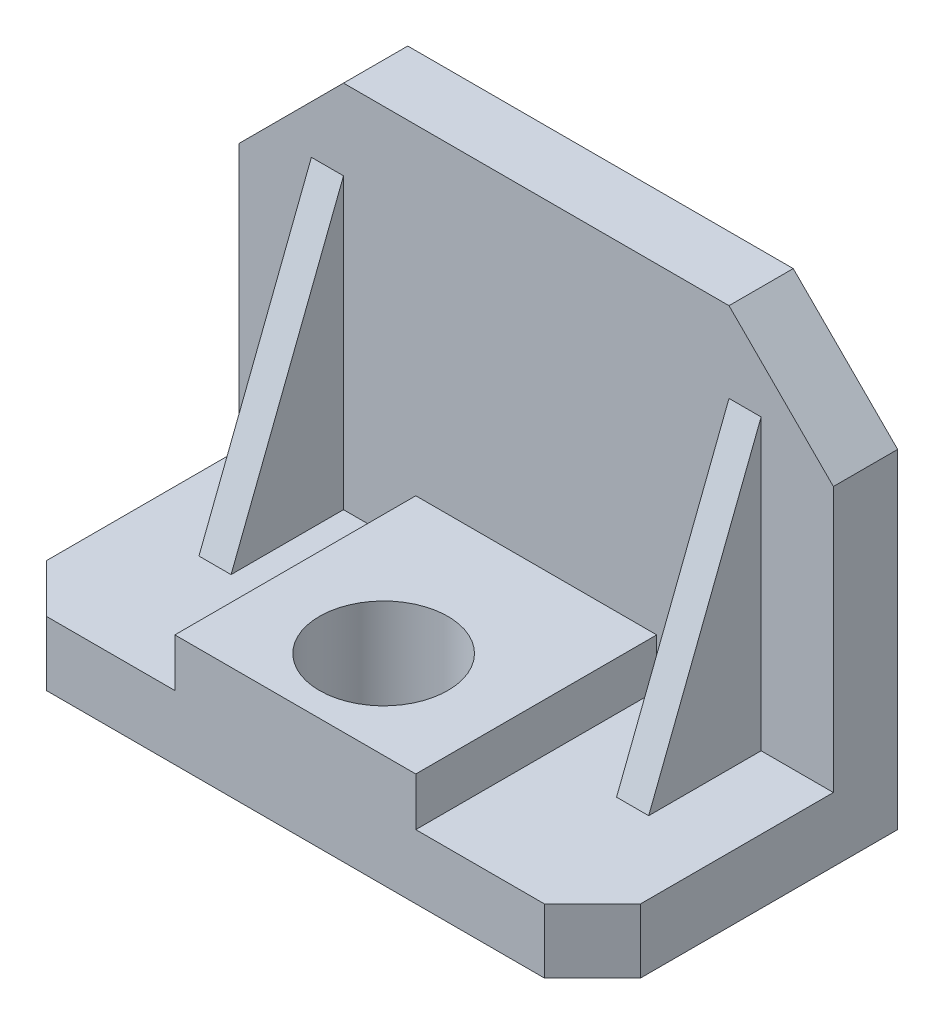
ISO-10303-21;
HEADER;
FILE_DESCRIPTION(('STEP AP214'),'2;1');
FILE_NAME('part.step','',(''),(''),'','','');
FILE_SCHEMA(('AUTOMOTIVE_DESIGN { 1 0 10303 214 1 1 1 1 }'));
ENDSEC;
DATA;
#1=APPLICATION_CONTEXT('core data for automotive mechanical design processes');
#2=APPLICATION_PROTOCOL_DEFINITION('international standard','automotive_design',2000,#1);
#3=PRODUCT_CONTEXT('',#1,'mechanical');
#4=PRODUCT('Part','Part','',(#3));
#5=PRODUCT_RELATED_PRODUCT_CATEGORY('part','',(#4));
#6=PRODUCT_DEFINITION_FORMATION('','',#4);
#7=PRODUCT_DEFINITION_CONTEXT('part definition',#1,'design');
#8=PRODUCT_DEFINITION('design','',#6,#7);
#9=PRODUCT_DEFINITION_SHAPE('','',#8);
#10=(LENGTH_UNIT() NAMED_UNIT(*) SI_UNIT(.MILLI.,.METRE.));
#11=(NAMED_UNIT(*) PLANE_ANGLE_UNIT() SI_UNIT($,.RADIAN.));
#12=(NAMED_UNIT(*) SI_UNIT($,.STERADIAN.) SOLID_ANGLE_UNIT());
#13=UNCERTAINTY_MEASURE_WITH_UNIT(LENGTH_MEASURE(1.E-05),#10,'distance_accuracy_value','');
#14=(GEOMETRIC_REPRESENTATION_CONTEXT(3) GLOBAL_UNCERTAINTY_ASSIGNED_CONTEXT((#13)) GLOBAL_UNIT_ASSIGNED_CONTEXT((#10,
#11,#12)) REPRESENTATION_CONTEXT('',''));
#15=CARTESIAN_POINT('',(0.,0.,0.));
#16=DIRECTION('',(0.,0.,1.));
#17=DIRECTION('',(1.,0.,0.));
#18=AXIS2_PLACEMENT_3D('',#15,#16,#17);
#19=CARTESIAN_POINT('',(0.,0.,4.));
#20=DIRECTION('',(0.,0.,-1.));
#21=DIRECTION('',(-1.,0.,0.));
#22=AXIS2_PLACEMENT_3D('',#19,#20,#21);
#23=PLANE('',#22);
#24=DIRECTION('',(0.,-1.,0.));
#25=VECTOR('',#24,1.);
#26=CARTESIAN_POINT('',(-52.,14.,4.));
#27=LINE('',#26,#25);
#28=CARTESIAN_POINT('',(-52.,14.,4.));
#29=VERTEX_POINT('',#28);
#30=CARTESIAN_POINT('',(-52.,8.,4.));
#31=VERTEX_POINT('',#30);
#32=EDGE_CURVE('E288',#29,#31,#27,.T.);
#33=ORIENTED_EDGE('',*,*,#32,.F.);
#34=DIRECTION('',(-1.,0.,0.));
#35=VECTOR('',#34,1.);
#36=CARTESIAN_POINT('',(-52.,14.,4.));
#37=LINE('',#36,#35);
#38=CARTESIAN_POINT('',(-22.,14.,4.));
#39=VERTEX_POINT('',#38);
#40=EDGE_CURVE('E291',#39,#29,#37,.T.);
#41=ORIENTED_EDGE('',*,*,#40,.F.);
#42=DIRECTION('',(0.,-1.,0.));
#43=VECTOR('',#42,1.);
#44=CARTESIAN_POINT('',(-22.,14.,4.));
#45=LINE('',#44,#43);
#46=CARTESIAN_POINT('',(-22.,8.,4.));
#47=VERTEX_POINT('',#46);
#48=EDGE_CURVE('E290',#39,#47,#45,.T.);
#49=ORIENTED_EDGE('',*,*,#48,.T.);
#50=DIRECTION('',(-1.,0.,0.));
#51=VECTOR('',#50,1.);
#52=CARTESIAN_POINT('',(-74.,8.,4.));
#53=LINE('',#52,#51);
#54=CARTESIAN_POINT('',(-13.,8.,4.));
#55=VERTEX_POINT('',#54);
#56=EDGE_CURVE('E214',#55,#47,#53,.T.);
#57=ORIENTED_EDGE('',*,*,#56,.F.);
#58=DIRECTION('',(0.,-1.,0.));
#59=VECTOR('',#58,1.);
#60=CARTESIAN_POINT('',(-13.,0.,4.));
#61=LINE('',#60,#59);
#62=CARTESIAN_POINT('',(-13.,44.,4.));
#63=VERTEX_POINT('',#62);
#64=EDGE_CURVE('E182',#63,#55,#61,.T.);
#65=ORIENTED_EDGE('',*,*,#64,.F.);
#66=DIRECTION('',(-1.,0.,0.));
#67=VECTOR('',#66,1.);
#68=CARTESIAN_POINT('',(0.,44.,4.));
#69=LINE('',#68,#67);
#70=CARTESIAN_POINT('',(-9.,44.,4.));
#71=VERTEX_POINT('',#70);
#72=EDGE_CURVE('E261',#71,#63,#69,.T.);
#73=ORIENTED_EDGE('',*,*,#72,.F.);
#74=DIRECTION('',(0.,1.,0.));
#75=VECTOR('',#74,1.);
#76=CARTESIAN_POINT('',(-8.99999999999999,0.,4.));
#77=LINE('',#76,#75);
#78=CARTESIAN_POINT('',(-9.,8.,4.));
#79=VERTEX_POINT('',#78);
#80=EDGE_CURVE('E316',#79,#71,#77,.T.);
#81=ORIENTED_EDGE('',*,*,#80,.F.);
#82=CARTESIAN_POINT('',(0.,8.,4.));
#83=VERTEX_POINT('',#82);
#84=EDGE_CURVE('E207',#83,#79,#53,.T.);
#85=ORIENTED_EDGE('',*,*,#84,.F.);
#86=DIRECTION('',(0.,1.,0.));
#87=VECTOR('',#86,1.);
#88=CARTESIAN_POINT('',(0.,41.,4.));
#89=LINE('',#88,#87);
#90=CARTESIAN_POINT('',(0.,41.,4.));
#91=VERTEX_POINT('',#90);
#92=EDGE_CURVE('E219',#83,#91,#89,.T.);
#93=ORIENTED_EDGE('',*,*,#92,.T.);
#94=DIRECTION('',(-0.707106781186548,0.707106781186547,0.));
#95=VECTOR('',#94,1.);
#96=CARTESIAN_POINT('',(-13.,54.,4.));
#97=LINE('',#96,#95);
#98=CARTESIAN_POINT('',(-13.,54.,4.));
#99=VERTEX_POINT('',#98);
#100=EDGE_CURVE('E221',#91,#99,#97,.T.);
#101=ORIENTED_EDGE('',*,*,#100,.T.);
#102=DIRECTION('',(-1.,0.,0.));
#103=VECTOR('',#102,1.);
#104=CARTESIAN_POINT('',(-61.,54.,4.));
#105=LINE('',#104,#103);
#106=CARTESIAN_POINT('',(-61.,54.,4.));
#107=VERTEX_POINT('',#106);
#108=EDGE_CURVE('E224',#99,#107,#105,.T.);
#109=ORIENTED_EDGE('',*,*,#108,.T.);
#110=DIRECTION('',(-0.707106781186548,-0.707106781186547,0.));
#111=VECTOR('',#110,1.);
#112=CARTESIAN_POINT('',(-74.,41.,4.));
#113=LINE('',#112,#111);
#114=CARTESIAN_POINT('',(-74.,41.,4.));
#115=VERTEX_POINT('',#114);
#116=EDGE_CURVE('E226',#107,#115,#113,.T.);
#117=ORIENTED_EDGE('',*,*,#116,.T.);
#118=DIRECTION('',(0.,-1.,0.));
#119=VECTOR('',#118,1.);
#120=CARTESIAN_POINT('',(-74.,0.,4.));
#121=LINE('',#120,#119);
#122=CARTESIAN_POINT('',(-74.,8.,4.));
#123=VERTEX_POINT('',#122);
#124=EDGE_CURVE('E228',#115,#123,#121,.T.);
#125=ORIENTED_EDGE('',*,*,#124,.T.);
#126=CARTESIAN_POINT('',(-65.,8.,4.));
#127=VERTEX_POINT('',#126);
#128=EDGE_CURVE('E202',#127,#123,#53,.T.);
#129=ORIENTED_EDGE('',*,*,#128,.F.);
#130=DIRECTION('',(0.,-1.,0.));
#131=VECTOR('',#130,1.);
#132=CARTESIAN_POINT('',(-65.,0.,4.));
#133=LINE('',#132,#131);
#134=CARTESIAN_POINT('',(-65.,44.,4.));
#135=VERTEX_POINT('',#134);
#136=EDGE_CURVE('E200',#135,#127,#133,.T.);
#137=ORIENTED_EDGE('',*,*,#136,.F.);
#138=DIRECTION('',(-1.,0.,0.));
#139=VECTOR('',#138,1.);
#140=CARTESIAN_POINT('',(0.,44.,4.));
#141=LINE('',#140,#139);
#142=CARTESIAN_POINT('',(-61.,44.,4.));
#143=VERTEX_POINT('',#142);
#144=EDGE_CURVE('E259',#143,#135,#141,.T.);
#145=ORIENTED_EDGE('',*,*,#144,.F.);
#146=DIRECTION('',(0.,1.,0.));
#147=VECTOR('',#146,1.);
#148=CARTESIAN_POINT('',(-61.,0.,4.));
#149=LINE('',#148,#147);
#150=CARTESIAN_POINT('',(-61.,8.,4.));
#151=VERTEX_POINT('',#150);
#152=EDGE_CURVE('E188',#151,#143,#149,.T.);
#153=ORIENTED_EDGE('',*,*,#152,.F.);
#154=EDGE_CURVE('E193',#31,#151,#53,.T.);
#155=ORIENTED_EDGE('',*,*,#154,.F.);
#156=EDGE_LOOP('',(#33,#41,#49,#57,#65,#73,#81,#85,#93,#101,#109,#117,#125,#129,#137,#145,#153,#155));
#157=FACE_BOUND('',#156,.T.);
#158=ADVANCED_FACE('F33',(#157),#23,.F.);
#159=CARTESIAN_POINT('',(-74.,8.,34.));
#160=DIRECTION('',(0.,-1.,0.));
#161=DIRECTION('',(0.,0.,-1.));
#162=AXIS2_PLACEMENT_3D('',#159,#160,#161);
#163=PLANE('',#162);
#164=DIRECTION('',(1.,0.,0.));
#165=VECTOR('',#164,1.);
#166=CARTESIAN_POINT('',(-65.,8.,18.));
#167=LINE('',#166,#165);
#168=CARTESIAN_POINT('',(-65.,8.,18.));
#169=VERTEX_POINT('',#168);
#170=CARTESIAN_POINT('',(-61.,8.,18.));
#171=VERTEX_POINT('',#170);
#172=EDGE_CURVE('E170',#169,#171,#167,.T.);
#173=ORIENTED_EDGE('',*,*,#172,.F.);
#174=DIRECTION('',(0.,0.,-1.));
#175=VECTOR('',#174,1.);
#176=CARTESIAN_POINT('',(-65.,8.,18.));
#177=LINE('',#176,#175);
#178=EDGE_CURVE('E194',#169,#127,#177,.T.);
#179=ORIENTED_EDGE('',*,*,#178,.T.);
#180=ORIENTED_EDGE('',*,*,#128,.T.);
#181=DIRECTION('',(0.,0.,-1.));
#182=VECTOR('',#181,1.);
#183=CARTESIAN_POINT('',(-74.,8.,34.));
#184=LINE('',#183,#182);
#185=CARTESIAN_POINT('',(-74.,8.,28.));
#186=VERTEX_POINT('',#185);
#187=EDGE_CURVE('E211',#186,#123,#184,.T.);
#188=ORIENTED_EDGE('',*,*,#187,.F.);
#189=DIRECTION('',(-0.707315738687803,0.,-0.706897761917894));
#190=VECTOR('',#189,1.);
#191=CARTESIAN_POINT('',(-74.,8.,28.));
#192=LINE('',#191,#190);
#193=CARTESIAN_POINT('',(-67.9964523008071,8.,34.));
#194=VERTEX_POINT('',#193);
#195=EDGE_CURVE('E297',#194,#186,#192,.T.);
#196=ORIENTED_EDGE('',*,*,#195,.F.);
#197=DIRECTION('',(-1.,0.,0.));
#198=VECTOR('',#197,1.);
#199=CARTESIAN_POINT('',(-74.,8.,34.));
#200=LINE('',#199,#198);
#201=CARTESIAN_POINT('',(-52.,8.,34.));
#202=VERTEX_POINT('',#201);
#203=EDGE_CURVE('E206',#202,#194,#200,.T.);
#204=ORIENTED_EDGE('',*,*,#203,.F.);
#205=DIRECTION('',(0.,0.,1.));
#206=VECTOR('',#205,1.);
#207=CARTESIAN_POINT('',(-52.,8.,4.));
#208=LINE('',#207,#206);
#209=EDGE_CURVE('E48',#31,#202,#208,.T.);
#210=ORIENTED_EDGE('',*,*,#209,.F.);
#211=ORIENTED_EDGE('',*,*,#154,.T.);
#212=DIRECTION('',(0.,0.,-1.));
#213=VECTOR('',#212,1.);
#214=CARTESIAN_POINT('',(-61.,8.,18.));
#215=LINE('',#214,#213);
#216=EDGE_CURVE('E181',#171,#151,#215,.T.);
#217=ORIENTED_EDGE('',*,*,#216,.F.);
#218=EDGE_LOOP('',(#173,#179,#180,#188,#196,#204,#210,#211,#217));
#219=FACE_BOUND('',#218,.T.);
#220=ADVANCED_FACE('F191',(#219),#163,.F.);
#221=DIRECTION('',(0.,0.,-1.));
#222=VECTOR('',#221,1.);
#223=CARTESIAN_POINT('',(-22.,8.,4.));
#224=LINE('',#223,#222);
#225=CARTESIAN_POINT('',(-22.,8.,34.));
#226=VERTEX_POINT('',#225);
#227=EDGE_CURVE('E273',#226,#47,#224,.T.);
#228=ORIENTED_EDGE('',*,*,#227,.F.);
#229=CARTESIAN_POINT('',(-6.00000000000001,8.,34.));
#230=VERTEX_POINT('',#229);
#231=EDGE_CURVE('E208',#230,#226,#200,.T.);
#232=ORIENTED_EDGE('',*,*,#231,.F.);
#233=DIRECTION('',(-0.707106781186548,0.,0.707106781186547));
#234=VECTOR('',#233,1.);
#235=CARTESIAN_POINT('',(-6.,8.,34.));
#236=LINE('',#235,#234);
#237=CARTESIAN_POINT('',(0.,8.,28.));
#238=VERTEX_POINT('',#237);
#239=EDGE_CURVE('E56',#238,#230,#236,.T.);
#240=ORIENTED_EDGE('',*,*,#239,.F.);
#241=DIRECTION('',(0.,0.,-1.));
#242=VECTOR('',#241,1.);
#243=CARTESIAN_POINT('',(0.,8.,34.));
#244=LINE('',#243,#242);
#245=EDGE_CURVE('E216',#238,#83,#244,.T.);
#246=ORIENTED_EDGE('',*,*,#245,.T.);
#247=ORIENTED_EDGE('',*,*,#84,.T.);
#248=DIRECTION('',(0.,0.,-1.));
#249=VECTOR('',#248,1.);
#250=CARTESIAN_POINT('',(-9.,8.,18.));
#251=LINE('',#250,#249);
#252=CARTESIAN_POINT('',(-9.,8.,18.));
#253=VERTEX_POINT('',#252);
#254=EDGE_CURVE('E312',#253,#79,#251,.T.);
#255=ORIENTED_EDGE('',*,*,#254,.F.);
#256=DIRECTION('',(1.,0.,0.));
#257=VECTOR('',#256,1.);
#258=CARTESIAN_POINT('',(-13.,8.,18.));
#259=LINE('',#258,#257);
#260=CARTESIAN_POINT('',(-13.,8.,18.));
#261=VERTEX_POINT('',#260);
#262=EDGE_CURVE('E310',#261,#253,#259,.T.);
#263=ORIENTED_EDGE('',*,*,#262,.F.);
#264=DIRECTION('',(0.,0.,-1.));
#265=VECTOR('',#264,1.);
#266=CARTESIAN_POINT('',(-13.,8.,18.));
#267=LINE('',#266,#265);
#268=EDGE_CURVE('E314',#261,#55,#267,.T.);
#269=ORIENTED_EDGE('',*,*,#268,.T.);
#270=ORIENTED_EDGE('',*,*,#56,.T.);
#271=EDGE_LOOP('',(#228,#232,#240,#246,#247,#255,#263,#269,#270));
#272=FACE_BOUND('',#271,.T.);
#273=ADVANCED_FACE('F270',(#272),#163,.F.);
#274=CARTESIAN_POINT('',(0.,0.,4.));
#275=DIRECTION('',(0.,1.,0.));
#276=DIRECTION('',(0.,0.,1.));
#277=AXIS2_PLACEMENT_3D('',#274,#275,#276);
#278=PLANE('',#277);
#279=CARTESIAN_POINT('',(-37.,0.,23.));
#280=DIRECTION('',(0.,1.,0.));
#281=DIRECTION('',(0.,0.,1.));
#282=AXIS2_PLACEMENT_3D('',#279,#280,#281);
#283=CIRCLE('',#282,8.);
#284=CARTESIAN_POINT('',(-37.,0.,31.));
#285=VERTEX_POINT('',#284);
#286=EDGE_CURVE('E284',#285,#285,#283,.T.);
#287=ORIENTED_EDGE('',*,*,#286,.T.);
#288=EDGE_LOOP('',(#287));
#289=FACE_BOUND('',#288,.T.);
#290=DIRECTION('',(1.,0.,0.));
#291=VECTOR('',#290,1.);
#292=CARTESIAN_POINT('',(-74.,0.,34.));
#293=LINE('',#292,#291);
#294=CARTESIAN_POINT('',(-67.9964523008071,0.,34.));
#295=VERTEX_POINT('',#294);
#296=CARTESIAN_POINT('',(-6.,0.,34.));
#297=VERTEX_POINT('',#296);
#298=EDGE_CURVE('E203',#295,#297,#293,.T.);
#299=ORIENTED_EDGE('',*,*,#298,.F.);
#300=DIRECTION('',(-0.707315738687803,0.,-0.706897761917894));
#301=VECTOR('',#300,1.);
#302=CARTESIAN_POINT('',(-48.9781268930801,0.,53.0070868366219));
#303=LINE('',#302,#301);
#304=CARTESIAN_POINT('',(-74.,0.,28.));
#305=VERTEX_POINT('',#304);
#306=EDGE_CURVE('E307',#295,#305,#303,.T.);
#307=ORIENTED_EDGE('',*,*,#306,.T.);
#308=DIRECTION('',(0.,0.,-1.));
#309=VECTOR('',#308,1.);
#310=CARTESIAN_POINT('',(-74.,0.,4.));
#311=LINE('',#310,#309);
#312=CARTESIAN_POINT('',(-74.,0.,-4.));
#313=VERTEX_POINT('',#312);
#314=EDGE_CURVE('E231',#305,#313,#311,.T.);
#315=ORIENTED_EDGE('',*,*,#314,.T.);
#316=DIRECTION('',(1.,0.,0.));
#317=VECTOR('',#316,1.);
#318=CARTESIAN_POINT('',(0.,0.,-4.));
#319=LINE('',#318,#317);
#320=CARTESIAN_POINT('',(0.,0.,-4.));
#321=VERTEX_POINT('',#320);
#322=EDGE_CURVE('E218',#313,#321,#319,.T.);
#323=ORIENTED_EDGE('',*,*,#322,.T.);
#324=DIRECTION('',(0.,0.,-1.));
#325=VECTOR('',#324,1.);
#326=CARTESIAN_POINT('',(0.,0.,4.));
#327=LINE('',#326,#325);
#328=CARTESIAN_POINT('',(0.,0.,28.));
#329=VERTEX_POINT('',#328);
#330=EDGE_CURVE('E257',#329,#321,#327,.T.);
#331=ORIENTED_EDGE('',*,*,#330,.F.);
#332=DIRECTION('',(-0.707106781186548,0.,0.707106781186547));
#333=VECTOR('',#332,1.);
#334=CARTESIAN_POINT('',(12.,0.,16.));
#335=LINE('',#334,#333);
#336=EDGE_CURVE('E303',#329,#297,#335,.T.);
#337=ORIENTED_EDGE('',*,*,#336,.T.);
#338=EDGE_LOOP('',(#299,#307,#315,#323,#331,#337));
#339=FACE_BOUND('',#338,.T.);
#340=ADVANCED_FACE('F35',(#289,#339),#278,.F.);
#341=CARTESIAN_POINT('',(0.,41.,4.));
#342=DIRECTION('',(-1.,0.,0.));
#343=DIRECTION('',(0.,-1.,0.));
#344=AXIS2_PLACEMENT_3D('',#341,#342,#343);
#345=PLANE('',#344);
#346=ORIENTED_EDGE('',*,*,#245,.F.);
#347=DIRECTION('',(0.,1.,0.));
#348=VECTOR('',#347,1.);
#349=CARTESIAN_POINT('',(0.,-10.,28.));
#350=LINE('',#349,#348);
#351=EDGE_CURVE('E300',#329,#238,#350,.T.);
#352=ORIENTED_EDGE('',*,*,#351,.F.);
#353=ORIENTED_EDGE('',*,*,#330,.T.);
#354=DIRECTION('',(0.,1.,0.));
#355=VECTOR('',#354,1.);
#356=CARTESIAN_POINT('',(0.,41.,-4.));
#357=LINE('',#356,#355);
#358=CARTESIAN_POINT('',(0.,41.,-4.));
#359=VERTEX_POINT('',#358);
#360=EDGE_CURVE('E234',#321,#359,#357,.T.);
#361=ORIENTED_EDGE('',*,*,#360,.T.);
#362=DIRECTION('',(0.,0.,-1.));
#363=VECTOR('',#362,1.);
#364=CARTESIAN_POINT('',(0.,41.,4.));
#365=LINE('',#364,#363);
#366=EDGE_CURVE('E254',#91,#359,#365,.T.);
#367=ORIENTED_EDGE('',*,*,#366,.F.);
#368=ORIENTED_EDGE('',*,*,#92,.F.);
#369=EDGE_LOOP('',(#346,#352,#353,#361,#367,#368));
#370=FACE_BOUND('',#369,.T.);
#371=ADVANCED_FACE('F350',(#370),#345,.F.);
#372=CARTESIAN_POINT('',(-13.,54.,4.));
#373=DIRECTION('',(-0.707106781186547,-0.707106781186548,0.));
#374=DIRECTION('',(0.707106781186548,-0.707106781186547,0.));
#375=AXIS2_PLACEMENT_3D('',#372,#373,#374);
#376=PLANE('',#375);
#377=DIRECTION('',(-0.707106781186548,0.707106781186547,0.));
#378=VECTOR('',#377,1.);
#379=CARTESIAN_POINT('',(-13.,54.,-4.));
#380=LINE('',#379,#378);
#381=CARTESIAN_POINT('',(-13.,54.,-4.));
#382=VERTEX_POINT('',#381);
#383=EDGE_CURVE('E236',#359,#382,#380,.T.);
#384=ORIENTED_EDGE('',*,*,#383,.T.);
#385=DIRECTION('',(0.,0.,-1.));
#386=VECTOR('',#385,1.);
#387=CARTESIAN_POINT('',(-13.,54.,4.));
#388=LINE('',#387,#386);
#389=EDGE_CURVE('E251',#99,#382,#388,.T.);
#390=ORIENTED_EDGE('',*,*,#389,.F.);
#391=ORIENTED_EDGE('',*,*,#100,.F.);
#392=ORIENTED_EDGE('',*,*,#366,.T.);
#393=EDGE_LOOP('',(#384,#390,#391,#392));
#394=FACE_BOUND('',#393,.T.);
#395=ADVANCED_FACE('F407',(#394),#376,.F.);
#396=CARTESIAN_POINT('',(-61.,54.,4.));
#397=DIRECTION('',(0.,-1.,0.));
#398=DIRECTION('',(1.,0.,0.));
#399=AXIS2_PLACEMENT_3D('',#396,#397,#398);
#400=PLANE('',#399);
#401=DIRECTION('',(-1.,0.,0.));
#402=VECTOR('',#401,1.);
#403=CARTESIAN_POINT('',(-61.,54.,-4.));
#404=LINE('',#403,#402);
#405=CARTESIAN_POINT('',(-61.,54.,-4.));
#406=VERTEX_POINT('',#405);
#407=EDGE_CURVE('E238',#382,#406,#404,.T.);
#408=ORIENTED_EDGE('',*,*,#407,.T.);
#409=DIRECTION('',(0.,0.,-1.));
#410=VECTOR('',#409,1.);
#411=CARTESIAN_POINT('',(-61.,54.,4.));
#412=LINE('',#411,#410);
#413=EDGE_CURVE('E248',#107,#406,#412,.T.);
#414=ORIENTED_EDGE('',*,*,#413,.F.);
#415=ORIENTED_EDGE('',*,*,#108,.F.);
#416=ORIENTED_EDGE('',*,*,#389,.T.);
#417=EDGE_LOOP('',(#408,#414,#415,#416));
#418=FACE_BOUND('',#417,.T.);
#419=ADVANCED_FACE('F403',(#418),#400,.F.);
#420=CARTESIAN_POINT('',(-74.,41.,4.));
#421=DIRECTION('',(0.707106781186547,-0.707106781186548,0.));
#422=DIRECTION('',(0.707106781186548,0.707106781186547,0.));
#423=AXIS2_PLACEMENT_3D('',#420,#421,#422);
#424=PLANE('',#423);
#425=DIRECTION('',(-0.707106781186548,-0.707106781186547,0.));
#426=VECTOR('',#425,1.);
#427=CARTESIAN_POINT('',(-74.,41.,-4.));
#428=LINE('',#427,#426);
#429=CARTESIAN_POINT('',(-74.,41.,-4.));
#430=VERTEX_POINT('',#429);
#431=EDGE_CURVE('E240',#406,#430,#428,.T.);
#432=ORIENTED_EDGE('',*,*,#431,.T.);
#433=DIRECTION('',(0.,0.,-1.));
#434=VECTOR('',#433,1.);
#435=CARTESIAN_POINT('',(-74.,41.,4.));
#436=LINE('',#435,#434);
#437=EDGE_CURVE('E245',#115,#430,#436,.T.);
#438=ORIENTED_EDGE('',*,*,#437,.F.);
#439=ORIENTED_EDGE('',*,*,#116,.F.);
#440=ORIENTED_EDGE('',*,*,#413,.T.);
#441=EDGE_LOOP('',(#432,#438,#439,#440));
#442=FACE_BOUND('',#441,.T.);
#443=ADVANCED_FACE('F400',(#442),#424,.F.);
#444=CARTESIAN_POINT('',(-74.,0.,4.));
#445=DIRECTION('',(1.,0.,0.));
#446=DIRECTION('',(0.,0.,-1.));
#447=AXIS2_PLACEMENT_3D('',#444,#445,#446);
#448=PLANE('',#447);
#449=ORIENTED_EDGE('',*,*,#314,.F.);
#450=DIRECTION('',(0.,1.,0.));
#451=VECTOR('',#450,1.);
#452=CARTESIAN_POINT('',(-74.,-10.,28.));
#453=LINE('',#452,#451);
#454=EDGE_CURVE('E299',#305,#186,#453,.T.);
#455=ORIENTED_EDGE('',*,*,#454,.T.);
#456=ORIENTED_EDGE('',*,*,#187,.T.);
#457=ORIENTED_EDGE('',*,*,#124,.F.);
#458=ORIENTED_EDGE('',*,*,#437,.T.);
#459=DIRECTION('',(0.,-1.,0.));
#460=VECTOR('',#459,1.);
#461=CARTESIAN_POINT('',(-74.,0.,-4.));
#462=LINE('',#461,#460);
#463=EDGE_CURVE('E222',#430,#313,#462,.T.);
#464=ORIENTED_EDGE('',*,*,#463,.T.);
#465=EDGE_LOOP('',(#449,#455,#456,#457,#458,#464));
#466=FACE_BOUND('',#465,.T.);
#467=ADVANCED_FACE('F340',(#466),#448,.F.);
#468=CARTESIAN_POINT('',(0.,0.,-4.));
#469=DIRECTION('',(0.,0.,-1.));
#470=DIRECTION('',(-1.,0.,0.));
#471=AXIS2_PLACEMENT_3D('',#468,#469,#470);
#472=PLANE('',#471);
#473=ORIENTED_EDGE('',*,*,#322,.F.);
#474=ORIENTED_EDGE('',*,*,#463,.F.);
#475=ORIENTED_EDGE('',*,*,#431,.F.);
#476=ORIENTED_EDGE('',*,*,#407,.F.);
#477=ORIENTED_EDGE('',*,*,#383,.F.);
#478=ORIENTED_EDGE('',*,*,#360,.F.);
#479=EDGE_LOOP('',(#473,#474,#475,#476,#477,#478));
#480=FACE_BOUND('',#479,.T.);
#481=ADVANCED_FACE('F386',(#480),#472,.T.);
#482=CARTESIAN_POINT('',(0.,0.,34.));
#483=DIRECTION('',(0.,0.,-1.));
#484=DIRECTION('',(-1.,0.,0.));
#485=AXIS2_PLACEMENT_3D('',#482,#483,#484);
#486=PLANE('',#485);
#487=ORIENTED_EDGE('',*,*,#231,.T.);
#488=DIRECTION('',(0.,-1.,0.));
#489=VECTOR('',#488,1.);
#490=CARTESIAN_POINT('',(-22.,14.,34.));
#491=LINE('',#490,#489);
#492=CARTESIAN_POINT('',(-22.,14.,34.));
#493=VERTEX_POINT('',#492);
#494=EDGE_CURVE('E293',#493,#226,#491,.T.);
#495=ORIENTED_EDGE('',*,*,#494,.F.);
#496=DIRECTION('',(1.,0.,0.));
#497=VECTOR('',#496,1.);
#498=CARTESIAN_POINT('',(-52.,14.,34.));
#499=LINE('',#498,#497);
#500=CARTESIAN_POINT('',(-52.,14.,34.));
#501=VERTEX_POINT('',#500);
#502=EDGE_CURVE('E282',#501,#493,#499,.T.);
#503=ORIENTED_EDGE('',*,*,#502,.F.);
#504=DIRECTION('',(0.,-1.,0.));
#505=VECTOR('',#504,1.);
#506=CARTESIAN_POINT('',(-52.,14.,34.));
#507=LINE('',#506,#505);
#508=EDGE_CURVE('E295',#501,#202,#507,.T.);
#509=ORIENTED_EDGE('',*,*,#508,.T.);
#510=ORIENTED_EDGE('',*,*,#203,.T.);
#511=DIRECTION('',(0.,-1.,0.));
#512=VECTOR('',#511,1.);
#513=CARTESIAN_POINT('',(-67.9964523008071,0.,34.));
#514=LINE('',#513,#512);
#515=EDGE_CURVE('E11',#194,#295,#514,.T.);
#516=ORIENTED_EDGE('',*,*,#515,.T.);
#517=ORIENTED_EDGE('',*,*,#298,.T.);
#518=DIRECTION('',(0.,1.,0.));
#519=VECTOR('',#518,1.);
#520=CARTESIAN_POINT('',(-6.,0.,34.));
#521=LINE('',#520,#519);
#522=EDGE_CURVE('E41',#297,#230,#521,.T.);
#523=ORIENTED_EDGE('',*,*,#522,.T.);
#524=EDGE_LOOP('',(#487,#495,#503,#509,#510,#516,#517,#523));
#525=FACE_BOUND('',#524,.T.);
#526=ADVANCED_FACE('F264',(#525),#486,.F.);
#527=CARTESIAN_POINT('',(-65.,44.,18.));
#528=DIRECTION('',(1.,0.,0.));
#529=DIRECTION('',(0.,0.,-1.));
#530=AXIS2_PLACEMENT_3D('',#527,#528,#529);
#531=PLANE('',#530);
#532=ORIENTED_EDGE('',*,*,#178,.F.);
#533=DIRECTION('',(0.,0.932004671541296,-0.362446261154949));
#534=VECTOR('',#533,1.);
#535=CARTESIAN_POINT('',(-65.,39.2707774798928,5.83914209115282));
#536=LINE('',#535,#534);
#537=EDGE_CURVE('E176',#169,#135,#536,.T.);
#538=ORIENTED_EDGE('',*,*,#537,.T.);
#539=ORIENTED_EDGE('',*,*,#136,.T.);
#540=EDGE_LOOP('',(#532,#538,#539));
#541=FACE_BOUND('',#540,.T.);
#542=ADVANCED_FACE('F378',(#541),#531,.F.);
#543=CARTESIAN_POINT('',(-61.,44.,18.));
#544=DIRECTION('',(-1.,0.,0.));
#545=DIRECTION('',(0.,-1.,0.));
#546=AXIS2_PLACEMENT_3D('',#543,#544,#545);
#547=PLANE('',#546);
#548=ORIENTED_EDGE('',*,*,#152,.T.);
#549=DIRECTION('',(0.,0.932004671541296,-0.362446261154949));
#550=VECTOR('',#549,1.);
#551=CARTESIAN_POINT('',(-61.,44.,4.));
#552=LINE('',#551,#550);
#553=EDGE_CURVE('E173',#171,#143,#552,.T.);
#554=ORIENTED_EDGE('',*,*,#553,.F.);
#555=ORIENTED_EDGE('',*,*,#216,.T.);
#556=EDGE_LOOP('',(#548,#554,#555));
#557=FACE_BOUND('',#556,.T.);
#558=ADVANCED_FACE('F186',(#557),#547,.F.);
#559=CARTESIAN_POINT('',(-13.,44.,18.));
#560=DIRECTION('',(1.,0.,0.));
#561=DIRECTION('',(0.,1.,0.));
#562=AXIS2_PLACEMENT_3D('',#559,#560,#561);
#563=PLANE('',#562);
#564=ORIENTED_EDGE('',*,*,#268,.F.);
#565=DIRECTION('',(0.,0.932004671541296,-0.362446261154948));
#566=VECTOR('',#565,1.);
#567=CARTESIAN_POINT('',(-13.,39.2707774798928,5.83914209115281));
#568=LINE('',#567,#566);
#569=EDGE_CURVE('E324',#261,#63,#568,.T.);
#570=ORIENTED_EDGE('',*,*,#569,.T.);
#571=ORIENTED_EDGE('',*,*,#64,.T.);
#572=EDGE_LOOP('',(#564,#570,#571));
#573=FACE_BOUND('',#572,.T.);
#574=ADVANCED_FACE('F322',(#573),#563,.F.);
#575=CARTESIAN_POINT('',(-9.,44.,18.));
#576=DIRECTION('',(-1.,0.,0.));
#577=DIRECTION('',(0.,-1.,0.));
#578=AXIS2_PLACEMENT_3D('',#575,#576,#577);
#579=PLANE('',#578);
#580=ORIENTED_EDGE('',*,*,#80,.T.);
#581=DIRECTION('',(0.,0.932004671541296,-0.362446261154948));
#582=VECTOR('',#581,1.);
#583=CARTESIAN_POINT('',(-9.,44.,4.));
#584=LINE('',#583,#582);
#585=EDGE_CURVE('E359',#253,#71,#584,.T.);
#586=ORIENTED_EDGE('',*,*,#585,.F.);
#587=ORIENTED_EDGE('',*,*,#254,.T.);
#588=EDGE_LOOP('',(#580,#586,#587));
#589=FACE_BOUND('',#588,.T.);
#590=ADVANCED_FACE('F358',(#589),#579,.F.);
#591=CARTESIAN_POINT('',(-6.,-10.,34.));
#592=DIRECTION('',(-0.707106781186547,0.,-0.707106781186548));
#593=DIRECTION('',(-0.707106781186548,0.,0.707106781186547));
#594=AXIS2_PLACEMENT_3D('',#591,#592,#593);
#595=PLANE('',#594);
#596=ORIENTED_EDGE('',*,*,#351,.T.);
#597=ORIENTED_EDGE('',*,*,#239,.T.);
#598=ORIENTED_EDGE('',*,*,#522,.F.);
#599=ORIENTED_EDGE('',*,*,#336,.F.);
#600=EDGE_LOOP('',(#596,#597,#598,#599));
#601=FACE_BOUND('',#600,.T.);
#602=ADVANCED_FACE('F348',(#601),#595,.F.);
#603=CARTESIAN_POINT('',(-74.,-10.,28.));
#604=DIRECTION('',(0.706897761917894,0.,-0.707315738687803));
#605=DIRECTION('',(-0.707315738687803,0.,-0.706897761917894));
#606=AXIS2_PLACEMENT_3D('',#603,#604,#605);
#607=PLANE('',#606);
#608=ORIENTED_EDGE('',*,*,#515,.F.);
#609=ORIENTED_EDGE('',*,*,#195,.T.);
#610=ORIENTED_EDGE('',*,*,#454,.F.);
#611=ORIENTED_EDGE('',*,*,#306,.F.);
#612=EDGE_LOOP('',(#608,#609,#610,#611));
#613=FACE_BOUND('',#612,.T.);
#614=ADVANCED_FACE('F344',(#613),#607,.F.);
#615=CARTESIAN_POINT('',(-52.,14.,4.));
#616=DIRECTION('',(1.,0.,0.));
#617=DIRECTION('',(0.,0.,-1.));
#618=AXIS2_PLACEMENT_3D('',#615,#616,#617);
#619=PLANE('',#618);
#620=ORIENTED_EDGE('',*,*,#209,.T.);
#621=ORIENTED_EDGE('',*,*,#508,.F.);
#622=DIRECTION('',(0.,0.,1.));
#623=VECTOR('',#622,1.);
#624=CARTESIAN_POINT('',(-52.,14.,4.));
#625=LINE('',#624,#623);
#626=EDGE_CURVE('E279',#29,#501,#625,.T.);
#627=ORIENTED_EDGE('',*,*,#626,.F.);
#628=ORIENTED_EDGE('',*,*,#32,.T.);
#629=EDGE_LOOP('',(#620,#621,#627,#628));
#630=FACE_BOUND('',#629,.T.);
#631=ADVANCED_FACE('F376',(#630),#619,.F.);
#632=CARTESIAN_POINT('',(-22.,14.,4.));
#633=DIRECTION('',(-1.,0.,0.));
#634=DIRECTION('',(0.,0.,1.));
#635=AXIS2_PLACEMENT_3D('',#632,#633,#634);
#636=PLANE('',#635);
#637=ORIENTED_EDGE('',*,*,#227,.T.);
#638=ORIENTED_EDGE('',*,*,#48,.F.);
#639=DIRECTION('',(0.,0.,-1.));
#640=VECTOR('',#639,1.);
#641=CARTESIAN_POINT('',(-22.,14.,4.));
#642=LINE('',#641,#640);
#643=EDGE_CURVE('E371',#493,#39,#642,.T.);
#644=ORIENTED_EDGE('',*,*,#643,.F.);
#645=ORIENTED_EDGE('',*,*,#494,.T.);
#646=EDGE_LOOP('',(#637,#638,#644,#645));
#647=FACE_BOUND('',#646,.T.);
#648=ADVANCED_FACE('F431',(#647),#636,.F.);
#649=CARTESIAN_POINT('',(0.,14.,0.));
#650=DIRECTION('',(0.,1.,0.));
#651=DIRECTION('',(0.,0.,1.));
#652=AXIS2_PLACEMENT_3D('',#649,#650,#651);
#653=PLANE('',#652);
#654=CARTESIAN_POINT('',(-37.,14.,23.));
#655=DIRECTION('',(0.,1.,0.));
#656=DIRECTION('',(0.,0.,1.));
#657=AXIS2_PLACEMENT_3D('',#654,#655,#656);
#658=CIRCLE('',#657,8.);
#659=CARTESIAN_POINT('',(-37.,14.,31.));
#660=VERTEX_POINT('',#659);
#661=EDGE_CURVE('E362',#660,#660,#658,.T.);
#662=ORIENTED_EDGE('',*,*,#661,.F.);
#663=EDGE_LOOP('',(#662));
#664=FACE_BOUND('',#663,.T.);
#665=ORIENTED_EDGE('',*,*,#626,.T.);
#666=ORIENTED_EDGE('',*,*,#502,.T.);
#667=ORIENTED_EDGE('',*,*,#643,.T.);
#668=ORIENTED_EDGE('',*,*,#40,.T.);
#669=EDGE_LOOP('',(#665,#666,#667,#668));
#670=FACE_BOUND('',#669,.T.);
#671=ADVANCED_FACE('F374',(#664,#670),#653,.T.);
#672=CARTESIAN_POINT('',(-37.,-36.,23.));
#673=DIRECTION('',(0.,1.,0.));
#674=DIRECTION('',(0.,0.,1.));
#675=AXIS2_PLACEMENT_3D('',#672,#673,#674);
#676=CYLINDRICAL_SURFACE('',#675,8.);
#677=ORIENTED_EDGE('',*,*,#661,.T.);
#678=EDGE_LOOP('',(#677));
#679=FACE_BOUND('',#678,.T.);
#680=ORIENTED_EDGE('',*,*,#286,.F.);
#681=EDGE_LOOP('',(#680));
#682=FACE_BOUND('',#681,.T.);
#683=ADVANCED_FACE('F421',(#679,#682),#676,.F.);
#684=CARTESIAN_POINT('',(-17.,44.,4.));
#685=DIRECTION('',(0.,-0.362446261154948,-0.932004671541296));
#686=DIRECTION('',(0.,0.932004671541296,-0.362446261154948));
#687=AXIS2_PLACEMENT_3D('',#684,#685,#686);
#688=PLANE('',#687);
#689=ORIENTED_EDGE('',*,*,#262,.T.);
#690=ORIENTED_EDGE('',*,*,#585,.T.);
#691=ORIENTED_EDGE('',*,*,#72,.T.);
#692=ORIENTED_EDGE('',*,*,#569,.F.);
#693=EDGE_LOOP('',(#689,#690,#691,#692));
#694=FACE_BOUND('',#693,.T.);
#695=ADVANCED_FACE('F423',(#694),#688,.F.);
#696=CARTESIAN_POINT('',(-69.,44.,4.));
#697=DIRECTION('',(0.,-0.362446261154949,-0.932004671541296));
#698=DIRECTION('',(0.,0.932004671541296,-0.362446261154949));
#699=AXIS2_PLACEMENT_3D('',#696,#697,#698);
#700=PLANE('',#699);
#701=ORIENTED_EDGE('',*,*,#172,.T.);
#702=ORIENTED_EDGE('',*,*,#553,.T.);
#703=ORIENTED_EDGE('',*,*,#144,.T.);
#704=ORIENTED_EDGE('',*,*,#537,.F.);
#705=EDGE_LOOP('',(#701,#702,#703,#704));
#706=FACE_BOUND('',#705,.T.);
#707=ADVANCED_FACE('F172',(#706),#700,.F.);
#708=CLOSED_SHELL('',(#158,#220,#273,#340,#371,#395,#419,#443,#467,#481,#526,#542,#558,#574,
#590,#602,#614,#631,#648,#671,#683,#695,#707));
#709=MANIFOLD_SOLID_BREP('B2',#708);
#710=ADVANCED_BREP_SHAPE_REPRESENTATION('',(#18,#709),#14);
#711=SHAPE_DEFINITION_REPRESENTATION(#9,#710);
ENDSEC;
END-ISO-10303-21;
